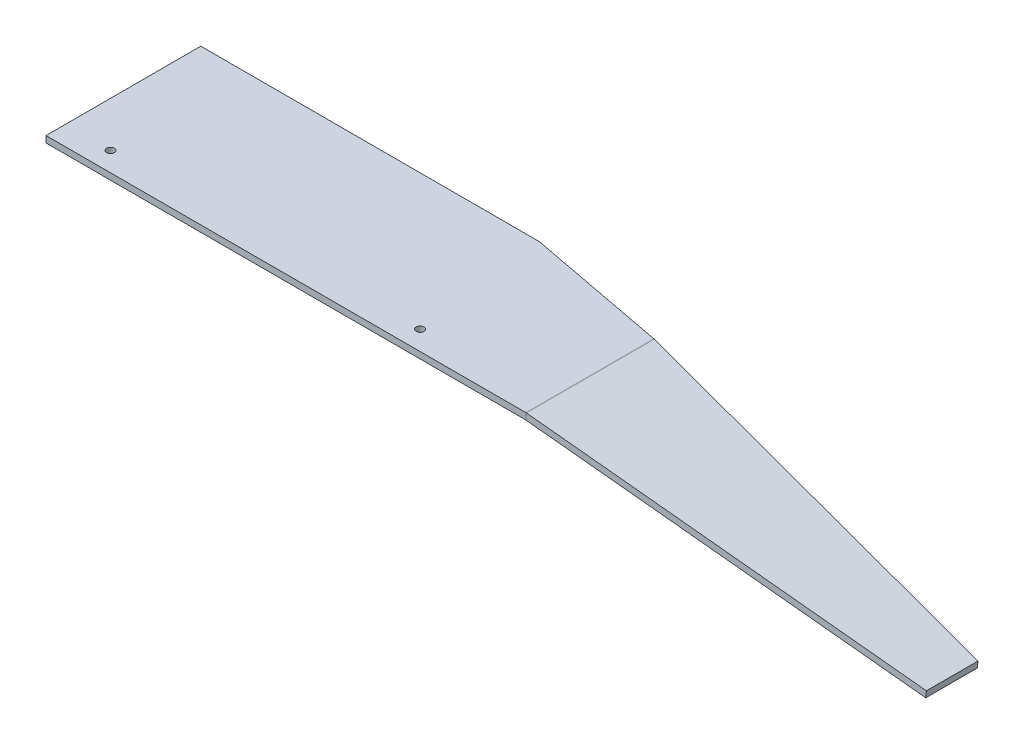
ISO-10303-21;
HEADER;
FILE_DESCRIPTION(('STEP AP214'),'2;1');
FILE_NAME('part.step','',(''),(''),'','','');
FILE_SCHEMA(('AUTOMOTIVE_DESIGN { 1 0 10303 214 1 1 1 1 }'));
ENDSEC;
DATA;
#1=APPLICATION_CONTEXT('core data for automotive mechanical design processes');
#2=APPLICATION_PROTOCOL_DEFINITION('international standard','automotive_design',2000,#1);
#3=PRODUCT_CONTEXT('',#1,'mechanical');
#4=PRODUCT('Part','Part','',(#3));
#5=PRODUCT_RELATED_PRODUCT_CATEGORY('part','',(#4));
#6=PRODUCT_DEFINITION_FORMATION('','',#4);
#7=PRODUCT_DEFINITION_CONTEXT('part definition',#1,'design');
#8=PRODUCT_DEFINITION('design','',#6,#7);
#9=PRODUCT_DEFINITION_SHAPE('','',#8);
#10=(LENGTH_UNIT() NAMED_UNIT(*) SI_UNIT(.MILLI.,.METRE.));
#11=(NAMED_UNIT(*) PLANE_ANGLE_UNIT() SI_UNIT($,.RADIAN.));
#12=(NAMED_UNIT(*) SI_UNIT($,.STERADIAN.) SOLID_ANGLE_UNIT());
#13=UNCERTAINTY_MEASURE_WITH_UNIT(LENGTH_MEASURE(1.E-05),#10,'distance_accuracy_value','');
#14=(GEOMETRIC_REPRESENTATION_CONTEXT(3) GLOBAL_UNCERTAINTY_ASSIGNED_CONTEXT((#13)) GLOBAL_UNIT_ASSIGNED_CONTEXT((#10,
#11,#12)) REPRESENTATION_CONTEXT('',''));
#15=CARTESIAN_POINT('',(0.,0.,0.));
#16=DIRECTION('',(0.,0.,1.));
#17=DIRECTION('',(1.,0.,0.));
#18=AXIS2_PLACEMENT_3D('',#15,#16,#17);
#19=CARTESIAN_POINT('',(615.894778692257,-624.559320806367,120.));
#20=DIRECTION('',(0.,0.,1.));
#21=DIRECTION('',(0.994877046559801,-0.101092345053657,0.));
#22=AXIS2_PLACEMENT_3D('',#19,#20,#21);
#23=PLANE('',#22);
#24=DIRECTION('',(0.994877046559801,-0.101092345053657,0.));
#25=VECTOR('',#24,1.);
#26=CARTESIAN_POINT('',(372.253379889322,62.5000000000001,120.));
#27=LINE('',#26,#25);
#28=CARTESIAN_POINT('',(372.510503361987,62.4738729374551,120.));
#29=VERTEX_POINT('',#28);
#30=CARTESIAN_POINT('',(682.505461725269,30.9743852327991,120.));
#31=VERTEX_POINT('',#30);
#32=EDGE_CURVE('E227',#29,#31,#27,.T.);
#33=ORIENTED_EDGE('',*,*,#32,.F.);
#34=DIRECTION('',(0.101092345053657,0.994877046559801,0.));
#35=VECTOR('',#34,1.);
#36=CARTESIAN_POINT('',(305.899820328975,-593.059833101711,120.));
#37=LINE('',#36,#35);
#38=CARTESIAN_POINT('',(372.005041636719,57.499487704656,120.));
#39=VERTEX_POINT('',#38);
#40=EDGE_CURVE('E120',#39,#29,#37,.T.);
#41=ORIENTED_EDGE('',*,*,#40,.F.);
#42=DIRECTION('',(-0.994877046559801,0.101092345053657,0.));
#43=VECTOR('',#42,1.);
#44=CARTESIAN_POINT('',(682.,26.0000000000002,120.));
#45=LINE('',#44,#43);
#46=CARTESIAN_POINT('',(682.,26.0000000000002,120.));
#47=VERTEX_POINT('',#46);
#48=EDGE_CURVE('E213',#47,#39,#45,.T.);
#49=ORIENTED_EDGE('',*,*,#48,.F.);
#50=DIRECTION('',(0.101092345053657,0.994877046559801,0.));
#51=VECTOR('',#50,1.);
#52=CARTESIAN_POINT('',(615.894778692257,-624.559320806367,120.));
#53=LINE('',#52,#51);
#54=EDGE_CURVE('E208',#47,#31,#53,.T.);
#55=ORIENTED_EDGE('',*,*,#54,.T.);
#56=EDGE_LOOP('',(#33,#41,#49,#55));
#57=FACE_BOUND('',#56,.T.);
#58=ADVANCED_FACE('F39',(#57),#23,.T.);
#59=CARTESIAN_POINT('',(615.894778692257,-624.559320806367,120.));
#60=DIRECTION('',(-0.994877046559801,0.101092345053657,0.));
#61=DIRECTION('',(0.101092345053657,0.994877046559801,0.));
#62=AXIS2_PLACEMENT_3D('',#59,#60,#61);
#63=PLANE('',#62);
#64=ORIENTED_EDGE('',*,*,#54,.F.);
#65=DIRECTION('',(0.,0.,-1.));
#66=VECTOR('',#65,1.);
#67=CARTESIAN_POINT('',(682.,26.0000000000002,120.));
#68=LINE('',#67,#66);
#69=CARTESIAN_POINT('',(682.,26.0000000000002,80.));
#70=VERTEX_POINT('',#69);
#71=EDGE_CURVE('E65',#47,#70,#68,.T.);
#72=ORIENTED_EDGE('',*,*,#71,.T.);
#73=DIRECTION('',(0.101092345053657,0.994877046559801,0.));
#74=VECTOR('',#73,1.);
#75=CARTESIAN_POINT('',(615.894778692257,-624.559320806367,80.));
#76=LINE('',#75,#74);
#77=CARTESIAN_POINT('',(682.505461725269,30.9743852327992,80.));
#78=VERTEX_POINT('',#77);
#79=EDGE_CURVE('E211',#70,#78,#76,.T.);
#80=ORIENTED_EDGE('',*,*,#79,.T.);
#81=DIRECTION('',(0.,0.,-1.));
#82=VECTOR('',#81,1.);
#83=CARTESIAN_POINT('',(682.505461725269,30.9743852327992,120.));
#84=LINE('',#83,#82);
#85=EDGE_CURVE('E57',#31,#78,#84,.T.);
#86=ORIENTED_EDGE('',*,*,#85,.F.);
#87=EDGE_LOOP('',(#64,#72,#80,#86));
#88=FACE_BOUND('',#87,.T.);
#89=ADVANCED_FACE('F201',(#88),#63,.F.);
#90=CARTESIAN_POINT('',(323.677518425526,-594.866276617974,24.3395694730037));
#91=DIRECTION('',(0.185233026500808,-0.0188220655960498,-0.98251435396133));
#92=DIRECTION('',(-0.977480978671659,0.0993246800908293,-0.186186853080316));
#93=AXIS2_PLACEMENT_3D('',#90,#91,#92);
#94=PLANE('',#93);
#95=DIRECTION('',(0.977480978671659,-0.0993246800908296,0.186186853080316));
#96=VECTOR('',#95,1.);
#97=CARTESIAN_POINT('',(390.288201458538,60.6674294211927,24.3395694730037));
#98=LINE('',#97,#96);
#99=CARTESIAN_POINT('',(372.510503361987,62.4738729374551,20.9533412641369));
#100=VERTEX_POINT('',#99);
#101=EDGE_CURVE('E11',#100,#78,#98,.T.);
#102=ORIENTED_EDGE('',*,*,#101,.T.);
#103=ORIENTED_EDGE('',*,*,#79,.F.);
#104=DIRECTION('',(-0.977480978671659,0.0993246800908294,-0.186186853080316));
#105=VECTOR('',#104,1.);
#106=CARTESIAN_POINT('',(389.782739733269,55.6930441883937,24.3395694730037));
#107=LINE('',#106,#105);
#108=CARTESIAN_POINT('',(372.005041636719,57.499487704656,20.9533412641369));
#109=VERTEX_POINT('',#108);
#110=EDGE_CURVE('E49',#70,#109,#107,.T.);
#111=ORIENTED_EDGE('',*,*,#110,.T.);
#112=CARTESIAN_POINT('',(372.510503361987,62.4738729374551,20.9533412641368));
#113=CARTESIAN_POINT('',(372.005041636719,57.499487704656,20.9533412641368));
#114=B_SPLINE_CURVE_WITH_KNOTS('',1,(#112,#113),.UNSPECIFIED.,.F.,.F.,(2,2),(0.,1.),.UNSPECIFIED.);
#115=EDGE_CURVE('E218',#109,#100,#114,.F.);
#116=ORIENTED_EDGE('',*,*,#115,.T.);
#117=EDGE_LOOP('',(#102,#103,#111,#116));
#118=FACE_BOUND('',#117,.T.);
#119=ADVANCED_FACE('F198',(#118),#94,.T.);
#120=CARTESIAN_POINT('',(682.,26.0000000000002,120.));
#121=DIRECTION('',(0.101092345053657,0.994877046559801,0.));
#122=DIRECTION('',(0.994877046559801,-0.101092345053657,0.));
#123=AXIS2_PLACEMENT_3D('',#120,#121,#122);
#124=PLANE('',#123);
#125=ORIENTED_EDGE('',*,*,#110,.F.);
#126=ORIENTED_EDGE('',*,*,#71,.F.);
#127=ORIENTED_EDGE('',*,*,#48,.T.);
#128=DIRECTION('',(0.,0.,1.));
#129=VECTOR('',#128,1.);
#130=CARTESIAN_POINT('',(372.005041636719,57.4994877046561,120.));
#131=LINE('',#130,#129);
#132=EDGE_CURVE('E215',#109,#39,#131,.T.);
#133=ORIENTED_EDGE('',*,*,#132,.F.);
#134=EDGE_LOOP('',(#125,#126,#127,#133));
#135=FACE_BOUND('',#134,.T.);
#136=ADVANCED_FACE('F195',(#135),#124,.F.);
#137=CARTESIAN_POINT('',(372.253379889322,62.5000000000001,120.));
#138=DIRECTION('',(-0.101092345053657,-0.994877046559801,0.));
#139=DIRECTION('',(-0.994877046559801,0.101092345053657,0.));
#140=AXIS2_PLACEMENT_3D('',#137,#138,#139);
#141=PLANE('',#140);
#142=ORIENTED_EDGE('',*,*,#32,.T.);
#143=ORIENTED_EDGE('',*,*,#85,.T.);
#144=ORIENTED_EDGE('',*,*,#101,.F.);
#145=DIRECTION('',(0.,0.,-1.));
#146=VECTOR('',#145,1.);
#147=CARTESIAN_POINT('',(372.510503361987,62.4738729374551,120.));
#148=LINE('',#147,#146);
#149=EDGE_CURVE('E220',#29,#100,#148,.T.);
#150=ORIENTED_EDGE('',*,*,#149,.F.);
#151=EDGE_LOOP('',(#142,#143,#144,#150));
#152=FACE_BOUND('',#151,.T.);
#153=ADVANCED_FACE('F191',(#152),#141,.F.);
#154=CARTESIAN_POINT('',(1.08182812752018E-13,-724.242233048535,120.));
#155=DIRECTION('',(-1.,0.,0.));
#156=DIRECTION('',(0.,1.,0.));
#157=AXIS2_PLACEMENT_3D('',#154,#155,#156);
#158=PLANE('',#157);
#159=DIRECTION('',(0.,0.,-1.));
#160=VECTOR('',#159,1.);
#161=CARTESIAN_POINT('',(0.,62.5,120.));
#162=LINE('',#161,#160);
#163=CARTESIAN_POINT('',(0.,62.4999999999998,120.));
#164=VERTEX_POINT('',#163);
#165=CARTESIAN_POINT('',(0.,62.5,0.));
#166=VERTEX_POINT('',#165);
#167=EDGE_CURVE('E146',#164,#166,#162,.T.);
#168=ORIENTED_EDGE('',*,*,#167,.T.);
#169=DIRECTION('',(0.,1.,0.));
#170=VECTOR('',#169,1.);
#171=CARTESIAN_POINT('',(1.08182812752018E-13,-724.242233048535,0.));
#172=LINE('',#171,#170);
#173=CARTESIAN_POINT('',(0.,57.4999999999998,0.));
#174=VERTEX_POINT('',#173);
#175=EDGE_CURVE('E154',#174,#166,#172,.T.);
#176=ORIENTED_EDGE('',*,*,#175,.F.);
#177=DIRECTION('',(0.,0.,-1.));
#178=VECTOR('',#177,1.);
#179=CARTESIAN_POINT('',(0.,57.5,120.));
#180=LINE('',#179,#178);
#181=CARTESIAN_POINT('',(0.,57.5,120.));
#182=VERTEX_POINT('',#181);
#183=EDGE_CURVE('E151',#182,#174,#180,.T.);
#184=ORIENTED_EDGE('',*,*,#183,.F.);
#185=DIRECTION('',(0.,1.,0.));
#186=VECTOR('',#185,1.);
#187=CARTESIAN_POINT('',(1.08182812752018E-13,-724.242233048535,120.));
#188=LINE('',#187,#186);
#189=EDGE_CURVE('E243',#182,#164,#188,.T.);
#190=ORIENTED_EDGE('',*,*,#189,.T.);
#191=EDGE_LOOP('',(#168,#176,#184,#190));
#192=FACE_BOUND('',#191,.T.);
#193=ADVANCED_FACE('F194',(#192),#158,.T.);
#194=CARTESIAN_POINT('',(372.,-724.242233048535,0.));
#195=DIRECTION('',(0.,0.,1.));
#196=DIRECTION('',(1.,0.,0.));
#197=AXIS2_PLACEMENT_3D('',#194,#195,#196);
#198=PLANE('',#197);
#199=DIRECTION('',(0.,1.,0.));
#200=VECTOR('',#199,1.);
#201=CARTESIAN_POINT('',(262.505461725269,-724.242233048535,0.));
#202=LINE('',#201,#200);
#203=CARTESIAN_POINT('',(262.505461725268,57.4999999999998,0.));
#204=VERTEX_POINT('',#203);
#205=CARTESIAN_POINT('',(262.505461725268,62.4999999999998,0.));
#206=VERTEX_POINT('',#205);
#207=EDGE_CURVE('E311',#204,#206,#202,.T.);
#208=ORIENTED_EDGE('',*,*,#207,.F.);
#209=DIRECTION('',(-1.,0.,0.));
#210=VECTOR('',#209,1.);
#211=CARTESIAN_POINT('',(372.,57.5000000000001,0.));
#212=LINE('',#211,#210);
#213=EDGE_CURVE('E309',#204,#174,#212,.T.);
#214=ORIENTED_EDGE('',*,*,#213,.T.);
#215=ORIENTED_EDGE('',*,*,#175,.T.);
#216=DIRECTION('',(1.,0.,0.));
#217=VECTOR('',#216,1.);
#218=CARTESIAN_POINT('',(0.,62.5,0.));
#219=LINE('',#218,#217);
#220=EDGE_CURVE('E147',#166,#206,#219,.T.);
#221=ORIENTED_EDGE('',*,*,#220,.T.);
#222=EDGE_LOOP('',(#208,#214,#215,#221));
#223=FACE_BOUND('',#222,.T.);
#224=ADVANCED_FACE('F317',(#223),#198,.F.);
#225=CARTESIAN_POINT('',(372.,57.5000000000001,120.));
#226=DIRECTION('',(0.,1.,0.));
#227=DIRECTION('',(1.,0.,0.));
#228=AXIS2_PLACEMENT_3D('',#225,#226,#227);
#229=PLANE('',#228);
#230=CARTESIAN_POINT('',(35.,57.5,105.));
#231=DIRECTION('',(0.,-1.,0.));
#232=DIRECTION('',(1.,0.,0.));
#233=AXIS2_PLACEMENT_3D('',#230,#231,#232);
#234=CIRCLE('',#233,3.);
#235=CARTESIAN_POINT('',(38.,57.5,105.));
#236=VERTEX_POINT('',#235);
#237=EDGE_CURVE('E335',#236,#236,#234,.T.);
#238=ORIENTED_EDGE('',*,*,#237,.F.);
#239=EDGE_LOOP('',(#238));
#240=FACE_BOUND('',#239,.T.);
#241=CARTESIAN_POINT('',(275.,57.5,105.));
#242=DIRECTION('',(0.,-1.,0.));
#243=DIRECTION('',(1.,0.,0.));
#244=AXIS2_PLACEMENT_3D('',#241,#242,#243);
#245=CIRCLE('',#244,2.99999999999999);
#246=CARTESIAN_POINT('',(278.,57.5,105.));
#247=VERTEX_POINT('',#246);
#248=EDGE_CURVE('E338',#247,#247,#245,.T.);
#249=ORIENTED_EDGE('',*,*,#248,.F.);
#250=EDGE_LOOP('',(#249));
#251=FACE_BOUND('',#250,.T.);
#252=DIRECTION('',(0.,0.,1.));
#253=VECTOR('',#252,1.);
#254=CARTESIAN_POINT('',(371.994932402214,57.5000000000001,120.));
#255=LINE('',#254,#253);
#256=CARTESIAN_POINT('',(371.994932402214,57.5000000000001,20.8551372717991));
#257=VERTEX_POINT('',#256);
#258=CARTESIAN_POINT('',(371.994932402214,57.5000000000001,120.));
#259=VERTEX_POINT('',#258);
#260=EDGE_CURVE('E138',#257,#259,#255,.T.);
#261=ORIENTED_EDGE('',*,*,#260,.T.);
#262=DIRECTION('',(-1.,0.,0.));
#263=VECTOR('',#262,1.);
#264=CARTESIAN_POINT('',(372.,57.5000000000001,120.));
#265=LINE('',#264,#263);
#266=EDGE_CURVE('E135',#259,#182,#265,.T.);
#267=ORIENTED_EDGE('',*,*,#266,.T.);
#268=ORIENTED_EDGE('',*,*,#183,.T.);
#269=ORIENTED_EDGE('',*,*,#213,.F.);
#270=DIRECTION('',(-0.982338566422475,0.,-0.187112107889995));
#271=VECTOR('',#270,1.);
#272=CARTESIAN_POINT('',(390.2233859685,57.5000000000001,24.3272236653774));
#273=LINE('',#272,#271);
#274=EDGE_CURVE('E172',#257,#204,#273,.T.);
#275=ORIENTED_EDGE('',*,*,#274,.F.);
#276=EDGE_LOOP('',(#261,#267,#268,#269,#275));
#277=FACE_BOUND('',#276,.T.);
#278=ADVANCED_FACE('F184',(#240,#251,#277),#229,.F.);
#279=CARTESIAN_POINT('',(390.2233859685,-724.242233048535,24.3272236653774));
#280=DIRECTION('',(-0.187112107889995,0.,0.982338566422475));
#281=DIRECTION('',(0.982338566422475,0.,0.187112107889995));
#282=AXIS2_PLACEMENT_3D('',#279,#280,#281);
#283=PLANE('',#282);
#284=CARTESIAN_POINT('',(371.994932402214,57.5000000000001,20.8551372717991));
#285=CARTESIAN_POINT('',(371.994932402214,62.5000000000001,20.8551372717991));
#286=B_SPLINE_CURVE_WITH_KNOTS('',1,(#284,#285),.UNSPECIFIED.,.F.,.F.,(2,2),(0.,1.),.UNSPECIFIED.);
#287=CARTESIAN_POINT('',(371.994932402214,62.4999999999999,20.8551372717991));
#288=VERTEX_POINT('',#287);
#289=EDGE_CURVE('E166',#257,#288,#286,.T.);
#290=ORIENTED_EDGE('',*,*,#289,.F.);
#291=ORIENTED_EDGE('',*,*,#274,.T.);
#292=ORIENTED_EDGE('',*,*,#207,.T.);
#293=DIRECTION('',(-0.982338566422475,0.,-0.187112107889995));
#294=VECTOR('',#293,1.);
#295=CARTESIAN_POINT('',(682.505461725268,62.5000000000002,80.));
#296=LINE('',#295,#294);
#297=EDGE_CURVE('E308',#288,#206,#296,.T.);
#298=ORIENTED_EDGE('',*,*,#297,.F.);
#299=EDGE_LOOP('',(#290,#291,#292,#298));
#300=FACE_BOUND('',#299,.T.);
#301=ADVANCED_FACE('F174',(#300),#283,.F.);
#302=CARTESIAN_POINT('',(0.,62.5,120.));
#303=DIRECTION('',(0.,-1.,0.));
#304=DIRECTION('',(0.,0.,1.));
#305=AXIS2_PLACEMENT_3D('',#302,#303,#304);
#306=PLANE('',#305);
#307=CARTESIAN_POINT('',(35.,62.5,105.));
#308=DIRECTION('',(0.,-1.,0.));
#309=DIRECTION('',(0.,0.,-1.));
#310=AXIS2_PLACEMENT_3D('',#307,#308,#309);
#311=CIRCLE('',#310,3.);
#312=CARTESIAN_POINT('',(35.,62.5,102.));
#313=VERTEX_POINT('',#312);
#314=EDGE_CURVE('E340',#313,#313,#311,.T.);
#315=ORIENTED_EDGE('',*,*,#314,.T.);
#316=EDGE_LOOP('',(#315));
#317=FACE_BOUND('',#316,.T.);
#318=CARTESIAN_POINT('',(275.,62.5000000000001,105.));
#319=DIRECTION('',(0.,-1.,0.));
#320=DIRECTION('',(0.,0.,-1.));
#321=AXIS2_PLACEMENT_3D('',#318,#319,#320);
#322=CIRCLE('',#321,2.99999999999999);
#323=CARTESIAN_POINT('',(275.,62.5000000000001,102.));
#324=VERTEX_POINT('',#323);
#325=EDGE_CURVE('E345',#324,#324,#322,.T.);
#326=ORIENTED_EDGE('',*,*,#325,.T.);
#327=EDGE_LOOP('',(#326));
#328=FACE_BOUND('',#327,.T.);
#329=DIRECTION('',(0.,0.,-1.));
#330=VECTOR('',#329,1.);
#331=CARTESIAN_POINT('',(371.994932402214,62.5000000000001,120.));
#332=LINE('',#331,#330);
#333=CARTESIAN_POINT('',(371.994932402214,62.5000000000001,120.));
#334=VERTEX_POINT('',#333);
#335=EDGE_CURVE('E137',#334,#288,#332,.T.);
#336=ORIENTED_EDGE('',*,*,#335,.T.);
#337=ORIENTED_EDGE('',*,*,#297,.T.);
#338=ORIENTED_EDGE('',*,*,#220,.F.);
#339=ORIENTED_EDGE('',*,*,#167,.F.);
#340=DIRECTION('',(1.,0.,0.));
#341=VECTOR('',#340,1.);
#342=CARTESIAN_POINT('',(0.,62.5,120.));
#343=LINE('',#342,#341);
#344=EDGE_CURVE('E133',#164,#334,#343,.T.);
#345=ORIENTED_EDGE('',*,*,#344,.T.);
#346=EDGE_LOOP('',(#336,#337,#338,#339,#345));
#347=FACE_BOUND('',#346,.T.);
#348=ADVANCED_FACE('F143',(#317,#328,#347),#306,.F.);
#349=CARTESIAN_POINT('',(372.,-724.242233048535,120.));
#350=DIRECTION('',(0.,0.,1.));
#351=DIRECTION('',(1.,0.,0.));
#352=AXIS2_PLACEMENT_3D('',#349,#350,#351);
#353=PLANE('',#352);
#354=ORIENTED_EDGE('',*,*,#344,.F.);
#355=ORIENTED_EDGE('',*,*,#189,.F.);
#356=ORIENTED_EDGE('',*,*,#266,.F.);
#357=DIRECTION('',(0.,1.,0.));
#358=VECTOR('',#357,1.);
#359=CARTESIAN_POINT('',(371.994932402214,-724.242233048535,120.));
#360=LINE('',#359,#358);
#361=EDGE_CURVE('E117',#259,#334,#360,.T.);
#362=ORIENTED_EDGE('',*,*,#361,.T.);
#363=EDGE_LOOP('',(#354,#355,#356,#362));
#364=FACE_BOUND('',#363,.T.);
#365=ADVANCED_FACE('F131',(#364),#353,.T.);
#366=CARTESIAN_POINT('',(371.994932402214,57.4000000000001,120.));
#367=DIRECTION('',(0.,0.,1.));
#368=DIRECTION('',(0.,1.,0.));
#369=AXIS2_PLACEMENT_3D('',#366,#367,#368);
#370=PLANE('',#369);
#371=ORIENTED_EDGE('',*,*,#40,.T.);
#372=CARTESIAN_POINT('',(371.994932402214,57.4000000000001,120.));
#373=DIRECTION('',(0.,0.,1.));
#374=DIRECTION('',(0.,-1.,0.));
#375=AXIS2_PLACEMENT_3D('',#372,#373,#374);
#376=CIRCLE('',#375,5.1);
#377=EDGE_CURVE('E114',#29,#334,#376,.T.);
#378=ORIENTED_EDGE('',*,*,#377,.T.);
#379=ORIENTED_EDGE('',*,*,#361,.F.);
#380=CARTESIAN_POINT('',(371.994932402214,57.4000000000001,120.));
#381=DIRECTION('',(0.,0.,1.));
#382=DIRECTION('',(0.,-1.,0.));
#383=AXIS2_PLACEMENT_3D('',#380,#381,#382);
#384=CIRCLE('',#383,0.100000000000005);
#385=EDGE_CURVE('E342',#39,#259,#384,.T.);
#386=ORIENTED_EDGE('',*,*,#385,.F.);
#387=EDGE_LOOP('',(#371,#378,#379,#386));
#388=FACE_BOUND('',#387,.T.);
#389=ADVANCED_FACE('F116',(#388),#370,.T.);
#390=CARTESIAN_POINT('',(371.994932402214,62.5000000000001,20.8551372717991));
#391=CARTESIAN_POINT('',(372.167083991894,62.5000000000001,20.887872036427));
#392=CARTESIAN_POINT('',(372.339233696886,62.4912761453605,20.920606499509));
#393=CARTESIAN_POINT('',(372.510503361987,62.4738729374551,20.9533412641368));
#394=CARTESIAN_POINT('',(371.994932402214,57.5000000000001,20.8551372717991));
#395=CARTESIAN_POINT('',(371.99830791333,57.5000000000001,20.8878719370237));
#396=CARTESIAN_POINT('',(372.001683418189,57.4998289429905,20.9206065989123));
#397=CARTESIAN_POINT('',(372.005041636719,57.499487704656,20.9533412641368));
#398=B_SPLINE_SURFACE_WITH_KNOTS('',1,3,((#390,#391,#392,#393),(#394,#395,#396,#397)),
.UNSPECIFIED.,.F.,.F.,.F.,(2,2),(4,4),(0.,1.),(0.,1.),.UNSPECIFIED.);
#399=CARTESIAN_POINT('',(372.005041636719,57.499487704656,20.9533412641368));
#400=CARTESIAN_POINT('',(372.001683418189,57.4998289429905,20.9206065989123));
#401=CARTESIAN_POINT('',(371.99830791333,57.5000000000001,20.8878719370237));
#402=CARTESIAN_POINT('',(371.994932402214,57.5000000000001,20.8551372717991));
#403=B_SPLINE_CURVE_WITH_KNOTS('',3,(#399,#400,#401,#402),.UNSPECIFIED.,.F.,.F.,(4,4),(0.,1.),.UNSPECIFIED.);
#404=EDGE_CURVE('E127',#257,#109,#403,.F.);
#405=CARTESIAN_POINT('',(371.994932402214,62.5000000000001,20.8551372717991));
#406=CARTESIAN_POINT('',(372.167083991894,62.5000000000001,20.887872036427));
#407=CARTESIAN_POINT('',(372.339233696886,62.4912761453605,20.920606499509));
#408=CARTESIAN_POINT('',(372.510503361987,62.4738729374551,20.9533412641368));
#409=B_SPLINE_CURVE_WITH_KNOTS('',3,(#405,#406,#407,#408),.UNSPECIFIED.,.F.,.F.,(4,4),(0.,1.),.UNSPECIFIED.);
#410=EDGE_CURVE('E126',#288,#100,#409,.T.);
#411=ORIENTED_EDGE('',*,*,#404,.F.);
#412=ORIENTED_EDGE('',*,*,#289,.T.);
#413=ORIENTED_EDGE('',*,*,#410,.T.);
#414=ORIENTED_EDGE('',*,*,#115,.F.);
#415=EDGE_LOOP('',(#411,#412,#413,#414));
#416=FACE_BOUND('',#415,.T.);
#417=ADVANCED_FACE('F253',(#416),#398,.F.);
#418=CARTESIAN_POINT('',(371.994932402214,57.4,814.316258978859));
#419=DIRECTION('',(0.,0.,-1.));
#420=DIRECTION('',(0.,-1.,0.));
#421=AXIS2_PLACEMENT_3D('',#418,#419,#420);
#422=CYLINDRICAL_SURFACE('',#421,5.1);
#423=ORIENTED_EDGE('',*,*,#335,.F.);
#424=ORIENTED_EDGE('',*,*,#377,.F.);
#425=ORIENTED_EDGE('',*,*,#149,.T.);
#426=ORIENTED_EDGE('',*,*,#410,.F.);
#427=EDGE_LOOP('',(#423,#424,#425,#426));
#428=FACE_BOUND('',#427,.T.);
#429=ADVANCED_FACE('F149',(#428),#422,.T.);
#430=CARTESIAN_POINT('',(371.994932402214,57.4,814.316258978859));
#431=DIRECTION('',(0.,0.,-1.));
#432=DIRECTION('',(0.,-1.,0.));
#433=AXIS2_PLACEMENT_3D('',#430,#431,#432);
#434=CYLINDRICAL_SURFACE('',#433,0.100000000000005);
#435=ORIENTED_EDGE('',*,*,#260,.F.);
#436=ORIENTED_EDGE('',*,*,#404,.T.);
#437=ORIENTED_EDGE('',*,*,#132,.T.);
#438=ORIENTED_EDGE('',*,*,#385,.T.);
#439=EDGE_LOOP('',(#435,#436,#437,#438));
#440=FACE_BOUND('',#439,.T.);
#441=ADVANCED_FACE('F361',(#440),#434,.F.);
#442=CARTESIAN_POINT('',(275.,25.9999750000001,105.));
#443=DIRECTION('',(0.,1.,0.));
#444=DIRECTION('',(0.,0.,-1.));
#445=AXIS2_PLACEMENT_3D('',#442,#443,#444);
#446=CYLINDRICAL_SURFACE('',#445,2.99999999999999);
#447=ORIENTED_EDGE('',*,*,#325,.F.);
#448=EDGE_LOOP('',(#447));
#449=FACE_BOUND('',#448,.T.);
#450=ORIENTED_EDGE('',*,*,#248,.T.);
#451=EDGE_LOOP('',(#450));
#452=FACE_BOUND('',#451,.T.);
#453=ADVANCED_FACE('F362',(#449,#452),#446,.F.);
#454=CARTESIAN_POINT('',(35.,25.999975,105.));
#455=DIRECTION('',(0.,1.,0.));
#456=DIRECTION('',(0.,0.,-1.));
#457=AXIS2_PLACEMENT_3D('',#454,#455,#456);
#458=CYLINDRICAL_SURFACE('',#457,3.);
#459=ORIENTED_EDGE('',*,*,#314,.F.);
#460=EDGE_LOOP('',(#459));
#461=FACE_BOUND('',#460,.T.);
#462=ORIENTED_EDGE('',*,*,#237,.T.);
#463=EDGE_LOOP('',(#462));
#464=FACE_BOUND('',#463,.T.);
#465=ADVANCED_FACE('F370',(#461,#464),#458,.F.);
#466=CLOSED_SHELL('',(#58,#89,#119,#136,#153,#193,#224,#278,#301,#348,#365,#389,#417,#429,#441,
#453,#465));
#467=MANIFOLD_SOLID_BREP('B2',#466);
#468=ADVANCED_BREP_SHAPE_REPRESENTATION('',(#18,#467),#14);
#469=SHAPE_DEFINITION_REPRESENTATION(#9,#468);
ENDSEC;
END-ISO-10303-21;
